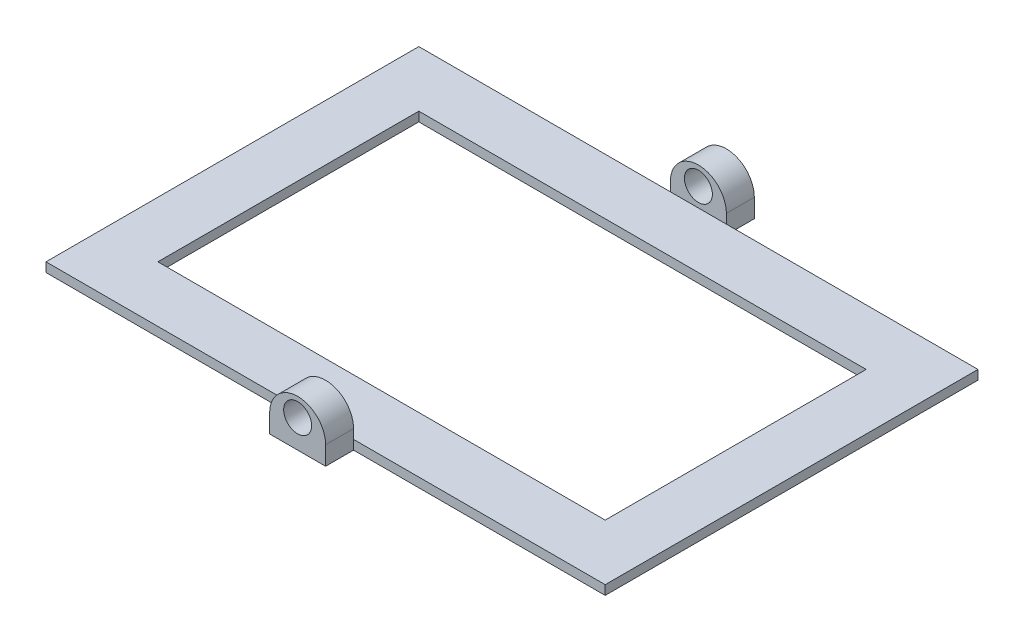
ISO-10303-21;
HEADER;
FILE_DESCRIPTION(('STEP AP214'),'2;1');
FILE_NAME('part.step','',(''),(''),'','','');
FILE_SCHEMA(('AUTOMOTIVE_DESIGN { 1 0 10303 214 1 1 1 1 }'));
ENDSEC;
DATA;
#1=APPLICATION_CONTEXT('core data for automotive mechanical design processes');
#2=APPLICATION_PROTOCOL_DEFINITION('international standard','automotive_design',2000,#1);
#3=PRODUCT_CONTEXT('',#1,'mechanical');
#4=PRODUCT('Part','Part','',(#3));
#5=PRODUCT_RELATED_PRODUCT_CATEGORY('part','',(#4));
#6=PRODUCT_DEFINITION_FORMATION('','',#4);
#7=PRODUCT_DEFINITION_CONTEXT('part definition',#1,'design');
#8=PRODUCT_DEFINITION('design','',#6,#7);
#9=PRODUCT_DEFINITION_SHAPE('','',#8);
#10=(LENGTH_UNIT() NAMED_UNIT(*) SI_UNIT(.MILLI.,.METRE.));
#11=(NAMED_UNIT(*) PLANE_ANGLE_UNIT() SI_UNIT($,.RADIAN.));
#12=(NAMED_UNIT(*) SI_UNIT($,.STERADIAN.) SOLID_ANGLE_UNIT());
#13=UNCERTAINTY_MEASURE_WITH_UNIT(LENGTH_MEASURE(1.E-05),#10,'distance_accuracy_value','');
#14=(GEOMETRIC_REPRESENTATION_CONTEXT(3) GLOBAL_UNCERTAINTY_ASSIGNED_CONTEXT((#13)) GLOBAL_UNIT_ASSIGNED_CONTEXT((#10,
#11,#12)) REPRESENTATION_CONTEXT('',''));
#15=CARTESIAN_POINT('',(0.,0.,0.));
#16=DIRECTION('',(0.,0.,1.));
#17=DIRECTION('',(1.,0.,0.));
#18=AXIS2_PLACEMENT_3D('',#15,#16,#17);
#19=CARTESIAN_POINT('',(64.8836150320105,5.,-31.9321489235153));
#20=DIRECTION('',(0.,0.,1.));
#21=DIRECTION('',(1.,0.,0.));
#22=AXIS2_PLACEMENT_3D('',#19,#20,#21);
#23=PLANE('',#22);
#24=DIRECTION('',(-1.,0.,0.));
#25=VECTOR('',#24,1.);
#26=CARTESIAN_POINT('',(64.8836150320105,5.,-31.9321489235153));
#27=LINE('',#26,#25);
#28=CARTESIAN_POINT('',(-100.11638496799,5.,-31.9321489235153));
#29=VERTEX_POINT('',#28);
#30=CARTESIAN_POINT('',(-235.11638496799,5.,-31.9321489235152));
#31=VERTEX_POINT('',#30);
#32=EDGE_CURVE('E282',#29,#31,#27,.T.);
#33=ORIENTED_EDGE('',*,*,#32,.F.);
#34=DIRECTION('',(0.,-1.,0.));
#35=VECTOR('',#34,1.);
#36=CARTESIAN_POINT('',(-100.11638496799,0.,-31.9321489235153));
#37=LINE('',#36,#35);
#38=CARTESIAN_POINT('',(-100.11638496799,0.,-31.9321489235153));
#39=VERTEX_POINT('',#38);
#40=EDGE_CURVE('E11',#29,#39,#37,.T.);
#41=ORIENTED_EDGE('',*,*,#40,.T.);
#42=DIRECTION('',(-1.,0.,0.));
#43=VECTOR('',#42,1.);
#44=CARTESIAN_POINT('',(64.8836150320105,0.,-31.9321489235153));
#45=LINE('',#44,#43);
#46=CARTESIAN_POINT('',(-235.11638496799,0.,-31.9321489235152));
#47=VERTEX_POINT('',#46);
#48=EDGE_CURVE('E295',#39,#47,#45,.T.);
#49=ORIENTED_EDGE('',*,*,#48,.T.);
#50=DIRECTION('',(0.,-1.,0.));
#51=VECTOR('',#50,1.);
#52=CARTESIAN_POINT('',(-235.11638496799,5.,-31.9321489235152));
#53=LINE('',#52,#51);
#54=EDGE_CURVE('E286',#31,#47,#53,.T.);
#55=ORIENTED_EDGE('',*,*,#54,.F.);
#56=EDGE_LOOP('',(#33,#41,#49,#55));
#57=FACE_BOUND('',#56,.T.);
#58=ADVANCED_FACE('F37',(#57),#23,.F.);
#59=CARTESIAN_POINT('',(64.8836150320105,5.,168.067851076485));
#60=DIRECTION('',(0.,0.,-1.));
#61=DIRECTION('',(-1.,0.,0.));
#62=AXIS2_PLACEMENT_3D('',#59,#60,#61);
#63=PLANE('',#62);
#64=DIRECTION('',(0.,1.,0.));
#65=VECTOR('',#64,1.);
#66=CARTESIAN_POINT('',(-70.1163849679895,0.,168.067851076485));
#67=LINE('',#66,#65);
#68=CARTESIAN_POINT('',(-70.1163849679895,0.,168.067851076485));
#69=VERTEX_POINT('',#68);
#70=CARTESIAN_POINT('',(-70.1163849679895,5.,168.067851076485));
#71=VERTEX_POINT('',#70);
#72=EDGE_CURVE('E214',#69,#71,#67,.T.);
#73=ORIENTED_EDGE('',*,*,#72,.F.);
#74=DIRECTION('',(1.,0.,0.));
#75=VECTOR('',#74,1.);
#76=CARTESIAN_POINT('',(64.8836150320105,0.,168.067851076485));
#77=LINE('',#76,#75);
#78=CARTESIAN_POINT('',(64.8836150320105,0.,168.067851076485));
#79=VERTEX_POINT('',#78);
#80=EDGE_CURVE('E290',#69,#79,#77,.T.);
#81=ORIENTED_EDGE('',*,*,#80,.T.);
#82=DIRECTION('',(0.,-1.,0.));
#83=VECTOR('',#82,1.);
#84=CARTESIAN_POINT('',(64.8836150320105,5.,168.067851076485));
#85=LINE('',#84,#83);
#86=CARTESIAN_POINT('',(64.8836150320105,5.,168.067851076485));
#87=VERTEX_POINT('',#86);
#88=EDGE_CURVE('E302',#87,#79,#85,.T.);
#89=ORIENTED_EDGE('',*,*,#88,.F.);
#90=DIRECTION('',(1.,0.,0.));
#91=VECTOR('',#90,1.);
#92=CARTESIAN_POINT('',(64.8836150320105,5.,168.067851076485));
#93=LINE('',#92,#91);
#94=EDGE_CURVE('E63',#71,#87,#93,.T.);
#95=ORIENTED_EDGE('',*,*,#94,.F.);
#96=EDGE_LOOP('',(#73,#81,#89,#95));
#97=FACE_BOUND('',#96,.T.);
#98=ADVANCED_FACE('F339',(#97),#63,.F.);
#99=DIRECTION('',(0.,-1.,0.));
#100=VECTOR('',#99,1.);
#101=CARTESIAN_POINT('',(-100.11638496799,0.,168.067851076485));
#102=LINE('',#101,#100);
#103=CARTESIAN_POINT('',(-100.11638496799,5.,168.067851076485));
#104=VERTEX_POINT('',#103);
#105=CARTESIAN_POINT('',(-100.11638496799,0.,168.067851076485));
#106=VERTEX_POINT('',#105);
#107=EDGE_CURVE('E46',#104,#106,#102,.T.);
#108=ORIENTED_EDGE('',*,*,#107,.F.);
#109=CARTESIAN_POINT('',(-235.11638496799,5.,168.067851076485));
#110=VERTEX_POINT('',#109);
#111=EDGE_CURVE('E276',#110,#104,#93,.T.);
#112=ORIENTED_EDGE('',*,*,#111,.F.);
#113=DIRECTION('',(0.,-1.,0.));
#114=VECTOR('',#113,1.);
#115=CARTESIAN_POINT('',(-235.11638496799,5.,168.067851076485));
#116=LINE('',#115,#114);
#117=CARTESIAN_POINT('',(-235.11638496799,0.,168.067851076485));
#118=VERTEX_POINT('',#117);
#119=EDGE_CURVE('E41',#110,#118,#116,.T.);
#120=ORIENTED_EDGE('',*,*,#119,.T.);
#121=EDGE_CURVE('E291',#118,#106,#77,.T.);
#122=ORIENTED_EDGE('',*,*,#121,.T.);
#123=EDGE_LOOP('',(#108,#112,#120,#122));
#124=FACE_BOUND('',#123,.T.);
#125=ADVANCED_FACE('F356',(#124),#63,.F.);
#126=CARTESIAN_POINT('',(0.,5.,0.));
#127=DIRECTION('',(0.,1.,0.));
#128=DIRECTION('',(0.,0.,1.));
#129=AXIS2_PLACEMENT_3D('',#126,#127,#128);
#130=PLANE('',#129);
#131=DIRECTION('',(0.,0.,1.));
#132=VECTOR('',#131,1.);
#133=CARTESIAN_POINT('',(-235.11638496799,5.,168.067851076485));
#134=LINE('',#133,#132);
#135=EDGE_CURVE('E272',#31,#110,#134,.T.);
#136=ORIENTED_EDGE('',*,*,#135,.T.);
#137=ORIENTED_EDGE('',*,*,#111,.T.);
#138=EDGE_CURVE('E280',#104,#71,#93,.T.);
#139=ORIENTED_EDGE('',*,*,#138,.T.);
#140=ORIENTED_EDGE('',*,*,#94,.T.);
#141=DIRECTION('',(0.,0.,-1.));
#142=VECTOR('',#141,1.);
#143=CARTESIAN_POINT('',(64.8836150320105,5.,168.067851076485));
#144=LINE('',#143,#142);
#145=CARTESIAN_POINT('',(64.8836150320105,5.,-31.9321489235153));
#146=VERTEX_POINT('',#145);
#147=EDGE_CURVE('E279',#87,#146,#144,.T.);
#148=ORIENTED_EDGE('',*,*,#147,.T.);
#149=CARTESIAN_POINT('',(-70.1163849679895,5.,-31.9321489235152));
#150=VERTEX_POINT('',#149);
#151=EDGE_CURVE('E283',#146,#150,#27,.T.);
#152=ORIENTED_EDGE('',*,*,#151,.T.);
#153=EDGE_CURVE('E287',#150,#29,#27,.T.);
#154=ORIENTED_EDGE('',*,*,#153,.T.);
#155=ORIENTED_EDGE('',*,*,#32,.T.);
#156=EDGE_LOOP('',(#136,#137,#139,#140,#148,#152,#154,#155));
#157=FACE_BOUND('',#156,.T.);
#158=DIRECTION('',(-1.,0.,0.));
#159=VECTOR('',#158,1.);
#160=CARTESIAN_POINT('',(34.8836150320105,5.,-1.93214892351527));
#161=LINE('',#160,#159);
#162=CARTESIAN_POINT('',(34.8836150320105,5.,-1.93214892351527));
#163=VERTEX_POINT('',#162);
#164=CARTESIAN_POINT('',(-205.11638496799,5.,-1.93214892351526));
#165=VERTEX_POINT('',#164);
#166=EDGE_CURVE('E243',#163,#165,#161,.T.);
#167=ORIENTED_EDGE('',*,*,#166,.F.);
#168=DIRECTION('',(0.,0.,-1.));
#169=VECTOR('',#168,1.);
#170=CARTESIAN_POINT('',(34.8836150320105,5.,138.067851076485));
#171=LINE('',#170,#169);
#172=CARTESIAN_POINT('',(34.8836150320105,5.,138.067851076485));
#173=VERTEX_POINT('',#172);
#174=EDGE_CURVE('E241',#173,#163,#171,.T.);
#175=ORIENTED_EDGE('',*,*,#174,.F.);
#176=DIRECTION('',(1.,0.,0.));
#177=VECTOR('',#176,1.);
#178=CARTESIAN_POINT('',(34.8836150320105,5.,138.067851076485));
#179=LINE('',#178,#177);
#180=CARTESIAN_POINT('',(-205.11638496799,5.,138.067851076485));
#181=VERTEX_POINT('',#180);
#182=EDGE_CURVE('E249',#181,#173,#179,.T.);
#183=ORIENTED_EDGE('',*,*,#182,.F.);
#184=DIRECTION('',(0.,0.,1.));
#185=VECTOR('',#184,1.);
#186=CARTESIAN_POINT('',(-205.11638496799,5.,138.067851076485));
#187=LINE('',#186,#185);
#188=EDGE_CURVE('E246',#165,#181,#187,.T.);
#189=ORIENTED_EDGE('',*,*,#188,.F.);
#190=EDGE_LOOP('',(#167,#175,#183,#189));
#191=FACE_BOUND('',#190,.T.);
#192=ADVANCED_FACE('F336',(#157,#191),#130,.T.);
#193=CARTESIAN_POINT('',(0.,0.,0.));
#194=DIRECTION('',(0.,1.,0.));
#195=DIRECTION('',(0.,0.,1.));
#196=AXIS2_PLACEMENT_3D('',#193,#194,#195);
#197=PLANE('',#196);
#198=DIRECTION('',(0.,0.,1.));
#199=VECTOR('',#198,1.);
#200=CARTESIAN_POINT('',(-235.11638496799,0.,168.067851076485));
#201=LINE('',#200,#199);
#202=EDGE_CURVE('E271',#47,#118,#201,.T.);
#203=ORIENTED_EDGE('',*,*,#202,.F.);
#204=ORIENTED_EDGE('',*,*,#48,.F.);
#205=DIRECTION('',(0.,0.,1.));
#206=VECTOR('',#205,1.);
#207=CARTESIAN_POINT('',(-100.11638496799,0.,-46.9321489235153));
#208=LINE('',#207,#206);
#209=CARTESIAN_POINT('',(-100.11638496799,0.,-46.9321489235153));
#210=VERTEX_POINT('',#209);
#211=EDGE_CURVE('E201',#210,#39,#208,.T.);
#212=ORIENTED_EDGE('',*,*,#211,.F.);
#213=DIRECTION('',(1.,0.,0.));
#214=VECTOR('',#213,1.);
#215=CARTESIAN_POINT('',(-100.11638496799,0.,-46.9321489235153));
#216=LINE('',#215,#214);
#217=CARTESIAN_POINT('',(-70.1163849679895,0.,-46.9321489235153));
#218=VERTEX_POINT('',#217);
#219=EDGE_CURVE('E187',#210,#218,#216,.T.);
#220=ORIENTED_EDGE('',*,*,#219,.T.);
#221=DIRECTION('',(0.,0.,1.));
#222=VECTOR('',#221,1.);
#223=CARTESIAN_POINT('',(-70.1163849679895,0.,-46.9321489235153));
#224=LINE('',#223,#222);
#225=CARTESIAN_POINT('',(-70.1163849679895,0.,-31.9321489235153));
#226=VERTEX_POINT('',#225);
#227=EDGE_CURVE('E175',#218,#226,#224,.T.);
#228=ORIENTED_EDGE('',*,*,#227,.T.);
#229=CARTESIAN_POINT('',(64.8836150320105,0.,-31.9321489235153));
#230=VERTEX_POINT('',#229);
#231=EDGE_CURVE('E275',#230,#226,#45,.T.);
#232=ORIENTED_EDGE('',*,*,#231,.F.);
#233=DIRECTION('',(0.,0.,-1.));
#234=VECTOR('',#233,1.);
#235=CARTESIAN_POINT('',(64.8836150320105,0.,168.067851076485));
#236=LINE('',#235,#234);
#237=EDGE_CURVE('E293',#79,#230,#236,.T.);
#238=ORIENTED_EDGE('',*,*,#237,.F.);
#239=ORIENTED_EDGE('',*,*,#80,.F.);
#240=DIRECTION('',(0.,0.,-1.));
#241=VECTOR('',#240,1.);
#242=CARTESIAN_POINT('',(-70.1163849679895,0.,183.067851076485));
#243=LINE('',#242,#241);
#244=CARTESIAN_POINT('',(-70.1163849679895,0.,183.067851076485));
#245=VERTEX_POINT('',#244);
#246=EDGE_CURVE('E231',#245,#69,#243,.T.);
#247=ORIENTED_EDGE('',*,*,#246,.F.);
#248=DIRECTION('',(1.,0.,0.));
#249=VECTOR('',#248,1.);
#250=CARTESIAN_POINT('',(-100.11638496799,0.,183.067851076485));
#251=LINE('',#250,#249);
#252=CARTESIAN_POINT('',(-100.11638496799,0.,183.067851076485));
#253=VERTEX_POINT('',#252);
#254=EDGE_CURVE('E216',#253,#245,#251,.T.);
#255=ORIENTED_EDGE('',*,*,#254,.F.);
#256=DIRECTION('',(0.,0.,-1.));
#257=VECTOR('',#256,1.);
#258=CARTESIAN_POINT('',(-100.11638496799,0.,183.067851076485));
#259=LINE('',#258,#257);
#260=EDGE_CURVE('E234',#253,#106,#259,.T.);
#261=ORIENTED_EDGE('',*,*,#260,.T.);
#262=ORIENTED_EDGE('',*,*,#121,.F.);
#263=EDGE_LOOP('',(#203,#204,#212,#220,#228,#232,#238,#239,#247,#255,#261,#262));
#264=FACE_BOUND('',#263,.T.);
#265=DIRECTION('',(0.,0.,-1.));
#266=VECTOR('',#265,1.);
#267=CARTESIAN_POINT('',(34.8836150320105,0.,138.067851076485));
#268=LINE('',#267,#266);
#269=CARTESIAN_POINT('',(34.8836150320105,0.,138.067851076485));
#270=VERTEX_POINT('',#269);
#271=CARTESIAN_POINT('',(34.8836150320105,0.,-1.93214892351527));
#272=VERTEX_POINT('',#271);
#273=EDGE_CURVE('E240',#270,#272,#268,.T.);
#274=ORIENTED_EDGE('',*,*,#273,.T.);
#275=DIRECTION('',(-1.,0.,0.));
#276=VECTOR('',#275,1.);
#277=CARTESIAN_POINT('',(34.8836150320105,0.,-1.93214892351527));
#278=LINE('',#277,#276);
#279=CARTESIAN_POINT('',(-205.11638496799,0.,-1.93214892351526));
#280=VERTEX_POINT('',#279);
#281=EDGE_CURVE('E254',#272,#280,#278,.T.);
#282=ORIENTED_EDGE('',*,*,#281,.T.);
#283=DIRECTION('',(0.,0.,1.));
#284=VECTOR('',#283,1.);
#285=CARTESIAN_POINT('',(-205.11638496799,0.,138.067851076485));
#286=LINE('',#285,#284);
#287=CARTESIAN_POINT('',(-205.11638496799,0.,138.067851076485));
#288=VERTEX_POINT('',#287);
#289=EDGE_CURVE('E257',#280,#288,#286,.T.);
#290=ORIENTED_EDGE('',*,*,#289,.T.);
#291=DIRECTION('',(1.,0.,0.));
#292=VECTOR('',#291,1.);
#293=CARTESIAN_POINT('',(34.8836150320105,0.,138.067851076485));
#294=LINE('',#293,#292);
#295=EDGE_CURVE('E244',#288,#270,#294,.T.);
#296=ORIENTED_EDGE('',*,*,#295,.T.);
#297=EDGE_LOOP('',(#274,#282,#290,#296));
#298=FACE_BOUND('',#297,.T.);
#299=ADVANCED_FACE('F317',(#264,#298),#197,.F.);
#300=CARTESIAN_POINT('',(-235.11638496799,5.,168.067851076485));
#301=DIRECTION('',(1.,0.,0.));
#302=DIRECTION('',(0.,0.,-1.));
#303=AXIS2_PLACEMENT_3D('',#300,#301,#302);
#304=PLANE('',#303);
#305=ORIENTED_EDGE('',*,*,#202,.T.);
#306=ORIENTED_EDGE('',*,*,#119,.F.);
#307=ORIENTED_EDGE('',*,*,#135,.F.);
#308=ORIENTED_EDGE('',*,*,#54,.T.);
#309=EDGE_LOOP('',(#305,#306,#307,#308));
#310=FACE_BOUND('',#309,.T.);
#311=ADVANCED_FACE('F39',(#310),#304,.F.);
#312=CARTESIAN_POINT('',(64.8836150320105,5.,168.067851076485));
#313=DIRECTION('',(-1.,0.,0.));
#314=DIRECTION('',(0.,0.,1.));
#315=AXIS2_PLACEMENT_3D('',#312,#313,#314);
#316=PLANE('',#315);
#317=ORIENTED_EDGE('',*,*,#237,.T.);
#318=DIRECTION('',(0.,-1.,0.));
#319=VECTOR('',#318,1.);
#320=CARTESIAN_POINT('',(64.8836150320105,5.,-31.9321489235153));
#321=LINE('',#320,#319);
#322=EDGE_CURVE('E300',#146,#230,#321,.T.);
#323=ORIENTED_EDGE('',*,*,#322,.F.);
#324=ORIENTED_EDGE('',*,*,#147,.F.);
#325=ORIENTED_EDGE('',*,*,#88,.T.);
#326=EDGE_LOOP('',(#317,#323,#324,#325));
#327=FACE_BOUND('',#326,.T.);
#328=ADVANCED_FACE('F340',(#327),#316,.F.);
#329=ORIENTED_EDGE('',*,*,#231,.T.);
#330=DIRECTION('',(0.,1.,0.));
#331=VECTOR('',#330,1.);
#332=CARTESIAN_POINT('',(-70.1163849679895,0.,-31.9321489235153));
#333=LINE('',#332,#331);
#334=EDGE_CURVE('E196',#226,#150,#333,.T.);
#335=ORIENTED_EDGE('',*,*,#334,.T.);
#336=ORIENTED_EDGE('',*,*,#151,.F.);
#337=ORIENTED_EDGE('',*,*,#322,.T.);
#338=EDGE_LOOP('',(#329,#335,#336,#337));
#339=FACE_BOUND('',#338,.T.);
#340=ADVANCED_FACE('F344',(#339),#23,.F.);
#341=CARTESIAN_POINT('',(34.8836150320105,5.,138.067851076485));
#342=DIRECTION('',(-1.,0.,0.));
#343=DIRECTION('',(0.,0.,1.));
#344=AXIS2_PLACEMENT_3D('',#341,#342,#343);
#345=PLANE('',#344);
#346=ORIENTED_EDGE('',*,*,#273,.F.);
#347=DIRECTION('',(0.,-1.,0.));
#348=VECTOR('',#347,1.);
#349=CARTESIAN_POINT('',(34.8836150320105,5.,138.067851076485));
#350=LINE('',#349,#348);
#351=EDGE_CURVE('E251',#173,#270,#350,.T.);
#352=ORIENTED_EDGE('',*,*,#351,.F.);
#353=ORIENTED_EDGE('',*,*,#174,.T.);
#354=DIRECTION('',(0.,-1.,0.));
#355=VECTOR('',#354,1.);
#356=CARTESIAN_POINT('',(34.8836150320105,5.,-1.93214892351527));
#357=LINE('',#356,#355);
#358=EDGE_CURVE('E268',#163,#272,#357,.T.);
#359=ORIENTED_EDGE('',*,*,#358,.T.);
#360=EDGE_LOOP('',(#346,#352,#353,#359));
#361=FACE_BOUND('',#360,.T.);
#362=ADVANCED_FACE('F370',(#361),#345,.T.);
#363=CARTESIAN_POINT('',(34.8836150320105,5.,-1.93214892351527));
#364=DIRECTION('',(0.,0.,1.));
#365=DIRECTION('',(1.,0.,0.));
#366=AXIS2_PLACEMENT_3D('',#363,#364,#365);
#367=PLANE('',#366);
#368=ORIENTED_EDGE('',*,*,#281,.F.);
#369=ORIENTED_EDGE('',*,*,#358,.F.);
#370=ORIENTED_EDGE('',*,*,#166,.T.);
#371=DIRECTION('',(0.,-1.,0.));
#372=VECTOR('',#371,1.);
#373=CARTESIAN_POINT('',(-205.11638496799,5.,-1.93214892351526));
#374=LINE('',#373,#372);
#375=EDGE_CURVE('E266',#165,#280,#374,.T.);
#376=ORIENTED_EDGE('',*,*,#375,.T.);
#377=EDGE_LOOP('',(#368,#369,#370,#376));
#378=FACE_BOUND('',#377,.T.);
#379=ADVANCED_FACE('F375',(#378),#367,.T.);
#380=CARTESIAN_POINT('',(-205.11638496799,5.,138.067851076485));
#381=DIRECTION('',(1.,0.,0.));
#382=DIRECTION('',(0.,0.,-1.));
#383=AXIS2_PLACEMENT_3D('',#380,#381,#382);
#384=PLANE('',#383);
#385=ORIENTED_EDGE('',*,*,#289,.F.);
#386=ORIENTED_EDGE('',*,*,#375,.F.);
#387=ORIENTED_EDGE('',*,*,#188,.T.);
#388=DIRECTION('',(0.,-1.,0.));
#389=VECTOR('',#388,1.);
#390=CARTESIAN_POINT('',(-205.11638496799,5.,138.067851076485));
#391=LINE('',#390,#389);
#392=EDGE_CURVE('E264',#181,#288,#391,.T.);
#393=ORIENTED_EDGE('',*,*,#392,.T.);
#394=EDGE_LOOP('',(#385,#386,#387,#393));
#395=FACE_BOUND('',#394,.T.);
#396=ADVANCED_FACE('F389',(#395),#384,.T.);
#397=CARTESIAN_POINT('',(34.8836150320105,5.,138.067851076485));
#398=DIRECTION('',(0.,0.,-1.));
#399=DIRECTION('',(-1.,0.,0.));
#400=AXIS2_PLACEMENT_3D('',#397,#398,#399);
#401=PLANE('',#400);
#402=ORIENTED_EDGE('',*,*,#295,.F.);
#403=ORIENTED_EDGE('',*,*,#392,.F.);
#404=ORIENTED_EDGE('',*,*,#182,.T.);
#405=ORIENTED_EDGE('',*,*,#351,.T.);
#406=EDGE_LOOP('',(#402,#403,#404,#405));
#407=FACE_BOUND('',#406,.T.);
#408=ADVANCED_FACE('F393',(#407),#401,.T.);
#409=CARTESIAN_POINT('',(-85.1163849679895,10.,168.067851076485));
#410=DIRECTION('',(0.,0.,-1.));
#411=DIRECTION('',(-1.,0.,0.));
#412=AXIS2_PLACEMENT_3D('',#409,#410,#411);
#413=PLANE('',#412);
#414=CARTESIAN_POINT('',(-85.1163849679895,15.0716900809238,168.067851076485));
#415=DIRECTION('',(0.,0.,1.));
#416=DIRECTION('',(1.,0.,0.));
#417=AXIS2_PLACEMENT_3D('',#414,#415,#416);
#418=CIRCLE('',#417,7.5);
#419=CARTESIAN_POINT('',(-77.6163849679895,15.0716900809238,168.067851076485));
#420=VERTEX_POINT('',#419);
#421=EDGE_CURVE('E174',#420,#420,#418,.T.);
#422=ORIENTED_EDGE('',*,*,#421,.T.);
#423=EDGE_LOOP('',(#422));
#424=FACE_BOUND('',#423,.T.);
#425=ORIENTED_EDGE('',*,*,#138,.F.);
#426=CARTESIAN_POINT('',(-100.11638496799,10.,168.067851076485));
#427=VERTEX_POINT('',#426);
#428=EDGE_CURVE('E223',#427,#104,#102,.T.);
#429=ORIENTED_EDGE('',*,*,#428,.F.);
#430=CARTESIAN_POINT('',(-85.1163849679895,10.,168.067851076485));
#431=DIRECTION('',(0.,0.,1.));
#432=DIRECTION('',(-1.,0.,0.));
#433=AXIS2_PLACEMENT_3D('',#430,#431,#432);
#434=CIRCLE('',#433,15.);
#435=CARTESIAN_POINT('',(-70.1163849679895,10.,168.067851076485));
#436=VERTEX_POINT('',#435);
#437=EDGE_CURVE('E207',#436,#427,#434,.T.);
#438=ORIENTED_EDGE('',*,*,#437,.F.);
#439=EDGE_CURVE('E226',#71,#436,#67,.T.);
#440=ORIENTED_EDGE('',*,*,#439,.F.);
#441=EDGE_LOOP('',(#425,#429,#438,#440));
#442=FACE_BOUND('',#441,.T.);
#443=ADVANCED_FACE('F334',(#424,#442),#413,.T.);
#444=CARTESIAN_POINT('',(-85.1163849679895,10.,183.067851076485));
#445=DIRECTION('',(0.,0.,-1.));
#446=DIRECTION('',(-1.,0.,0.));
#447=AXIS2_PLACEMENT_3D('',#444,#445,#446);
#448=PLANE('',#447);
#449=CARTESIAN_POINT('',(-85.1163849679895,10.,183.067851076485));
#450=DIRECTION('',(0.,0.,1.));
#451=DIRECTION('',(-1.,0.,0.));
#452=AXIS2_PLACEMENT_3D('',#449,#450,#451);
#453=CIRCLE('',#452,15.);
#454=CARTESIAN_POINT('',(-70.1163849679895,10.,183.067851076485));
#455=VERTEX_POINT('',#454);
#456=CARTESIAN_POINT('',(-100.11638496799,10.,183.067851076485));
#457=VERTEX_POINT('',#456);
#458=EDGE_CURVE('E210',#455,#457,#453,.T.);
#459=ORIENTED_EDGE('',*,*,#458,.T.);
#460=DIRECTION('',(0.,-1.,0.));
#461=VECTOR('',#460,1.);
#462=CARTESIAN_POINT('',(-100.11638496799,0.,183.067851076485));
#463=LINE('',#462,#461);
#464=EDGE_CURVE('E213',#457,#253,#463,.T.);
#465=ORIENTED_EDGE('',*,*,#464,.T.);
#466=ORIENTED_EDGE('',*,*,#254,.T.);
#467=DIRECTION('',(0.,1.,0.));
#468=VECTOR('',#467,1.);
#469=CARTESIAN_POINT('',(-70.1163849679895,0.,183.067851076485));
#470=LINE('',#469,#468);
#471=EDGE_CURVE('E218',#245,#455,#470,.T.);
#472=ORIENTED_EDGE('',*,*,#471,.T.);
#473=EDGE_LOOP('',(#459,#465,#466,#472));
#474=FACE_BOUND('',#473,.T.);
#475=CARTESIAN_POINT('',(-85.1163849679895,15.0716900809238,183.067851076485));
#476=DIRECTION('',(0.,0.,1.));
#477=DIRECTION('',(1.,0.,0.));
#478=AXIS2_PLACEMENT_3D('',#475,#476,#477);
#479=CIRCLE('',#478,7.5);
#480=CARTESIAN_POINT('',(-77.6163849679895,15.0716900809238,183.067851076485));
#481=VERTEX_POINT('',#480);
#482=EDGE_CURVE('E204',#481,#481,#479,.T.);
#483=ORIENTED_EDGE('',*,*,#482,.F.);
#484=EDGE_LOOP('',(#483));
#485=FACE_BOUND('',#484,.T.);
#486=ADVANCED_FACE('F323',(#474,#485),#448,.F.);
#487=CARTESIAN_POINT('',(-85.1163849679895,10.,183.067851076485));
#488=DIRECTION('',(0.,0.,-1.));
#489=DIRECTION('',(-1.,0.,0.));
#490=AXIS2_PLACEMENT_3D('',#487,#488,#489);
#491=CYLINDRICAL_SURFACE('',#490,15.);
#492=ORIENTED_EDGE('',*,*,#437,.T.);
#493=DIRECTION('',(0.,0.,-1.));
#494=VECTOR('',#493,1.);
#495=CARTESIAN_POINT('',(-100.11638496799,10.,183.067851076485));
#496=LINE('',#495,#494);
#497=EDGE_CURVE('E237',#457,#427,#496,.T.);
#498=ORIENTED_EDGE('',*,*,#497,.F.);
#499=ORIENTED_EDGE('',*,*,#458,.F.);
#500=DIRECTION('',(0.,0.,-1.));
#501=VECTOR('',#500,1.);
#502=CARTESIAN_POINT('',(-70.1163849679895,10.,183.067851076485));
#503=LINE('',#502,#501);
#504=EDGE_CURVE('E220',#455,#436,#503,.T.);
#505=ORIENTED_EDGE('',*,*,#504,.T.);
#506=EDGE_LOOP('',(#492,#498,#499,#505));
#507=FACE_BOUND('',#506,.T.);
#508=ADVANCED_FACE('F330',(#507),#491,.T.);
#509=CARTESIAN_POINT('',(-100.11638496799,0.,183.067851076485));
#510=DIRECTION('',(1.,0.,0.));
#511=DIRECTION('',(0.,0.,-1.));
#512=AXIS2_PLACEMENT_3D('',#509,#510,#511);
#513=PLANE('',#512);
#514=ORIENTED_EDGE('',*,*,#428,.T.);
#515=ORIENTED_EDGE('',*,*,#107,.T.);
#516=ORIENTED_EDGE('',*,*,#260,.F.);
#517=ORIENTED_EDGE('',*,*,#464,.F.);
#518=ORIENTED_EDGE('',*,*,#497,.T.);
#519=EDGE_LOOP('',(#514,#515,#516,#517,#518));
#520=FACE_BOUND('',#519,.T.);
#521=ADVANCED_FACE('F313',(#520),#513,.F.);
#522=CARTESIAN_POINT('',(-70.1163849679895,0.,183.067851076485));
#523=DIRECTION('',(-1.,0.,0.));
#524=DIRECTION('',(0.,0.,1.));
#525=AXIS2_PLACEMENT_3D('',#522,#523,#524);
#526=PLANE('',#525);
#527=ORIENTED_EDGE('',*,*,#72,.T.);
#528=ORIENTED_EDGE('',*,*,#439,.T.);
#529=ORIENTED_EDGE('',*,*,#504,.F.);
#530=ORIENTED_EDGE('',*,*,#471,.F.);
#531=ORIENTED_EDGE('',*,*,#246,.T.);
#532=EDGE_LOOP('',(#527,#528,#529,#530,#531));
#533=FACE_BOUND('',#532,.T.);
#534=ADVANCED_FACE('F402',(#533),#526,.F.);
#535=CARTESIAN_POINT('',(-85.1163849679895,15.0716900809238,183.067851076485));
#536=DIRECTION('',(0.,0.,-1.));
#537=DIRECTION('',(-1.,0.,0.));
#538=AXIS2_PLACEMENT_3D('',#535,#536,#537);
#539=CYLINDRICAL_SURFACE('',#538,7.5);
#540=ORIENTED_EDGE('',*,*,#482,.T.);
#541=EDGE_LOOP('',(#540));
#542=FACE_BOUND('',#541,.T.);
#543=ORIENTED_EDGE('',*,*,#421,.F.);
#544=EDGE_LOOP('',(#543));
#545=FACE_BOUND('',#544,.T.);
#546=ADVANCED_FACE('F405',(#542,#545),#539,.F.);
#547=CARTESIAN_POINT('',(-85.1163849679895,10.,-31.9321489235153));
#548=DIRECTION('',(0.,0.,1.));
#549=DIRECTION('',(-1.,0.,0.));
#550=AXIS2_PLACEMENT_3D('',#547,#548,#549);
#551=PLANE('',#550);
#552=CARTESIAN_POINT('',(-85.1163849679895,15.0716900809238,-31.9321489235153));
#553=DIRECTION('',(0.,0.,1.));
#554=DIRECTION('',(1.,0.,0.));
#555=AXIS2_PLACEMENT_3D('',#552,#553,#554);
#556=CIRCLE('',#555,7.5);
#557=CARTESIAN_POINT('',(-77.6163849679895,15.0716900809238,-31.9321489235153));
#558=VERTEX_POINT('',#557);
#559=EDGE_CURVE('E438',#558,#558,#556,.T.);
#560=ORIENTED_EDGE('',*,*,#559,.F.);
#561=EDGE_LOOP('',(#560));
#562=FACE_BOUND('',#561,.T.);
#563=ORIENTED_EDGE('',*,*,#153,.F.);
#564=CARTESIAN_POINT('',(-70.1163849679895,10.,-31.9321489235153));
#565=VERTEX_POINT('',#564);
#566=EDGE_CURVE('E55',#150,#565,#333,.T.);
#567=ORIENTED_EDGE('',*,*,#566,.T.);
#568=CARTESIAN_POINT('',(-85.1163849679895,10.,-31.9321489235153));
#569=DIRECTION('',(0.,0.,1.));
#570=DIRECTION('',(-1.,0.,0.));
#571=AXIS2_PLACEMENT_3D('',#568,#569,#570);
#572=CIRCLE('',#571,15.);
#573=CARTESIAN_POINT('',(-100.11638496799,10.,-31.9321489235153));
#574=VERTEX_POINT('',#573);
#575=EDGE_CURVE('E172',#565,#574,#572,.T.);
#576=ORIENTED_EDGE('',*,*,#575,.T.);
#577=EDGE_CURVE('E48',#574,#29,#37,.T.);
#578=ORIENTED_EDGE('',*,*,#577,.T.);
#579=EDGE_LOOP('',(#563,#567,#576,#578));
#580=FACE_BOUND('',#579,.T.);
#581=ADVANCED_FACE('F349',(#562,#580),#551,.T.);
#582=CARTESIAN_POINT('',(-85.1163849679895,10.,-46.9321489235153));
#583=DIRECTION('',(0.,0.,1.));
#584=DIRECTION('',(1.,0.,0.));
#585=AXIS2_PLACEMENT_3D('',#582,#583,#584);
#586=CYLINDRICAL_SURFACE('',#585,15.);
#587=ORIENTED_EDGE('',*,*,#575,.F.);
#588=DIRECTION('',(0.,0.,1.));
#589=VECTOR('',#588,1.);
#590=CARTESIAN_POINT('',(-70.1163849679895,10.,-46.9321489235153));
#591=LINE('',#590,#589);
#592=CARTESIAN_POINT('',(-70.1163849679895,10.,-46.9321489235153));
#593=VERTEX_POINT('',#592);
#594=EDGE_CURVE('E166',#593,#565,#591,.T.);
#595=ORIENTED_EDGE('',*,*,#594,.F.);
#596=CARTESIAN_POINT('',(-85.1163849679895,10.,-46.9321489235153));
#597=DIRECTION('',(0.,0.,1.));
#598=DIRECTION('',(-1.,0.,0.));
#599=AXIS2_PLACEMENT_3D('',#596,#597,#598);
#600=CIRCLE('',#599,15.);
#601=CARTESIAN_POINT('',(-100.11638496799,10.,-46.9321489235153));
#602=VERTEX_POINT('',#601);
#603=EDGE_CURVE('E169',#593,#602,#600,.T.);
#604=ORIENTED_EDGE('',*,*,#603,.T.);
#605=DIRECTION('',(0.,0.,1.));
#606=VECTOR('',#605,1.);
#607=CARTESIAN_POINT('',(-100.11638496799,10.,-46.9321489235153));
#608=LINE('',#607,#606);
#609=EDGE_CURVE('E193',#602,#574,#608,.T.);
#610=ORIENTED_EDGE('',*,*,#609,.T.);
#611=EDGE_LOOP('',(#587,#595,#604,#610));
#612=FACE_BOUND('',#611,.T.);
#613=ADVANCED_FACE('F168',(#612),#586,.T.);
#614=CARTESIAN_POINT('',(-70.1163849679895,0.,-46.9321489235153));
#615=DIRECTION('',(1.,0.,0.));
#616=DIRECTION('',(0.,0.,-1.));
#617=AXIS2_PLACEMENT_3D('',#614,#615,#616);
#618=PLANE('',#617);
#619=ORIENTED_EDGE('',*,*,#334,.F.);
#620=ORIENTED_EDGE('',*,*,#227,.F.);
#621=DIRECTION('',(0.,1.,0.));
#622=VECTOR('',#621,1.);
#623=CARTESIAN_POINT('',(-70.1163849679895,0.,-46.9321489235153));
#624=LINE('',#623,#622);
#625=EDGE_CURVE('E181',#218,#593,#624,.T.);
#626=ORIENTED_EDGE('',*,*,#625,.T.);
#627=ORIENTED_EDGE('',*,*,#594,.T.);
#628=ORIENTED_EDGE('',*,*,#566,.F.);
#629=EDGE_LOOP('',(#619,#620,#626,#627,#628));
#630=FACE_BOUND('',#629,.T.);
#631=ADVANCED_FACE('F186',(#630),#618,.T.);
#632=CARTESIAN_POINT('',(-100.11638496799,0.,-46.9321489235153));
#633=DIRECTION('',(-1.,0.,0.));
#634=DIRECTION('',(0.,0.,1.));
#635=AXIS2_PLACEMENT_3D('',#632,#633,#634);
#636=PLANE('',#635);
#637=ORIENTED_EDGE('',*,*,#577,.F.);
#638=ORIENTED_EDGE('',*,*,#609,.F.);
#639=DIRECTION('',(0.,-1.,0.));
#640=VECTOR('',#639,1.);
#641=CARTESIAN_POINT('',(-100.11638496799,0.,-46.9321489235153));
#642=LINE('',#641,#640);
#643=EDGE_CURVE('E184',#602,#210,#642,.T.);
#644=ORIENTED_EDGE('',*,*,#643,.T.);
#645=ORIENTED_EDGE('',*,*,#211,.T.);
#646=ORIENTED_EDGE('',*,*,#40,.F.);
#647=EDGE_LOOP('',(#637,#638,#644,#645,#646));
#648=FACE_BOUND('',#647,.T.);
#649=ADVANCED_FACE('F419',(#648),#636,.T.);
#650=CARTESIAN_POINT('',(-85.1163849679895,10.,-46.9321489235153));
#651=DIRECTION('',(0.,0.,1.));
#652=DIRECTION('',(-1.,0.,0.));
#653=AXIS2_PLACEMENT_3D('',#650,#651,#652);
#654=PLANE('',#653);
#655=CARTESIAN_POINT('',(-85.1163849679895,15.0716900809238,-46.9321489235153));
#656=DIRECTION('',(0.,0.,1.));
#657=DIRECTION('',(1.,0.,0.));
#658=AXIS2_PLACEMENT_3D('',#655,#656,#657);
#659=CIRCLE('',#658,7.5);
#660=CARTESIAN_POINT('',(-77.6163849679895,15.0716900809238,-46.9321489235153));
#661=VERTEX_POINT('',#660);
#662=EDGE_CURVE('E195',#661,#661,#659,.T.);
#663=ORIENTED_EDGE('',*,*,#662,.T.);
#664=EDGE_LOOP('',(#663));
#665=FACE_BOUND('',#664,.T.);
#666=ORIENTED_EDGE('',*,*,#603,.F.);
#667=ORIENTED_EDGE('',*,*,#625,.F.);
#668=ORIENTED_EDGE('',*,*,#219,.F.);
#669=ORIENTED_EDGE('',*,*,#643,.F.);
#670=EDGE_LOOP('',(#666,#667,#668,#669));
#671=FACE_BOUND('',#670,.T.);
#672=ADVANCED_FACE('F179',(#665,#671),#654,.F.);
#673=CARTESIAN_POINT('',(-85.1163849679895,15.0716900809238,-46.9321489235153));
#674=DIRECTION('',(0.,0.,1.));
#675=DIRECTION('',(1.,0.,0.));
#676=AXIS2_PLACEMENT_3D('',#673,#674,#675);
#677=CYLINDRICAL_SURFACE('',#676,7.5);
#678=ORIENTED_EDGE('',*,*,#662,.F.);
#679=EDGE_LOOP('',(#678));
#680=FACE_BOUND('',#679,.T.);
#681=ORIENTED_EDGE('',*,*,#559,.T.);
#682=EDGE_LOOP('',(#681));
#683=FACE_BOUND('',#682,.T.);
#684=ADVANCED_FACE('F427',(#680,#683),#677,.F.);
#685=CLOSED_SHELL('',(#58,#98,#125,#192,#299,#311,#328,#340,#362,#379,#396,#408,#443,#486,#508,
#521,#534,#546,#581,#613,#631,#649,#672,#684));
#686=MANIFOLD_SOLID_BREP('B2',#685);
#687=ADVANCED_BREP_SHAPE_REPRESENTATION('',(#18,#686),#14);
#688=SHAPE_DEFINITION_REPRESENTATION(#9,#687);
ENDSEC;
END-ISO-10303-21;
